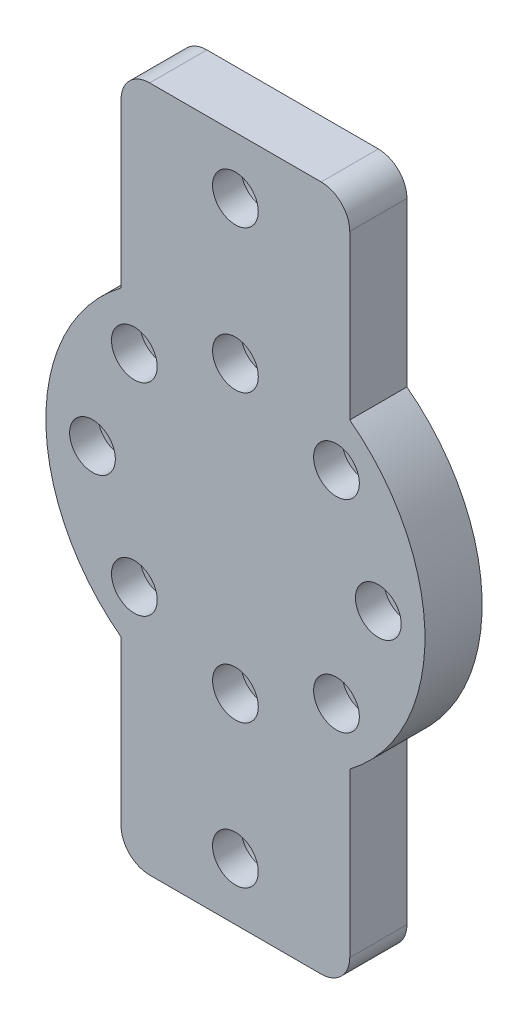
ISO-10303-21;
HEADER;
FILE_DESCRIPTION(('STEP AP214'),'2;1');
FILE_NAME('part.step','',(''),(''),'','','');
FILE_SCHEMA(('AUTOMOTIVE_DESIGN { 1 0 10303 214 1 1 1 1 }'));
ENDSEC;
DATA;
#1=APPLICATION_CONTEXT('core data for automotive mechanical design processes');
#2=APPLICATION_PROTOCOL_DEFINITION('international standard','automotive_design',2000,#1);
#3=PRODUCT_CONTEXT('',#1,'mechanical');
#4=PRODUCT('Part','Part','',(#3));
#5=PRODUCT_RELATED_PRODUCT_CATEGORY('part','',(#4));
#6=PRODUCT_DEFINITION_FORMATION('','',#4);
#7=PRODUCT_DEFINITION_CONTEXT('part definition',#1,'design');
#8=PRODUCT_DEFINITION('design','',#6,#7);
#9=PRODUCT_DEFINITION_SHAPE('','',#8);
#10=(LENGTH_UNIT() NAMED_UNIT(*) SI_UNIT(.MILLI.,.METRE.));
#11=(NAMED_UNIT(*) PLANE_ANGLE_UNIT() SI_UNIT($,.RADIAN.));
#12=(NAMED_UNIT(*) SI_UNIT($,.STERADIAN.) SOLID_ANGLE_UNIT());
#13=UNCERTAINTY_MEASURE_WITH_UNIT(LENGTH_MEASURE(1.E-05),#10,'distance_accuracy_value','');
#14=(GEOMETRIC_REPRESENTATION_CONTEXT(3) GLOBAL_UNCERTAINTY_ASSIGNED_CONTEXT((#13)) GLOBAL_UNIT_ASSIGNED_CONTEXT((#10,
#11,#12)) REPRESENTATION_CONTEXT('',''));
#15=CARTESIAN_POINT('',(0.,0.,0.));
#16=DIRECTION('',(0.,0.,1.));
#17=DIRECTION('',(1.,0.,0.));
#18=AXIS2_PLACEMENT_3D('',#15,#16,#17);
#19=CARTESIAN_POINT('',(0.,50.,10.));
#20=DIRECTION('',(0.,0.,-1.));
#21=DIRECTION('',(-1.,0.,0.));
#22=AXIS2_PLACEMENT_3D('',#19,#20,#21);
#23=CYLINDRICAL_SURFACE('',#22,4.00000000000001);
#24=CARTESIAN_POINT('',(0.,50.,10.));
#25=DIRECTION('',(0.,0.,1.));
#26=DIRECTION('',(1.,0.,0.));
#27=AXIS2_PLACEMENT_3D('',#24,#25,#26);
#28=CIRCLE('',#27,4.00000000000001);
#29=CARTESIAN_POINT('',(4.00000000000001,50.,10.));
#30=VERTEX_POINT('',#29);
#31=EDGE_CURVE('E297',#30,#30,#28,.T.);
#32=ORIENTED_EDGE('',*,*,#31,.T.);
#33=EDGE_LOOP('',(#32));
#34=FACE_BOUND('',#33,.T.);
#35=CARTESIAN_POINT('',(0.,50.,5.));
#36=DIRECTION('',(0.,0.,-1.));
#37=DIRECTION('',(-1.,0.,0.));
#38=AXIS2_PLACEMENT_3D('',#35,#36,#37);
#39=CIRCLE('',#38,4.00000000000001);
#40=CARTESIAN_POINT('',(-4.00000000000001,50.,5.));
#41=VERTEX_POINT('',#40);
#42=EDGE_CURVE('E36',#41,#41,#39,.T.);
#43=ORIENTED_EDGE('',*,*,#42,.T.);
#44=EDGE_LOOP('',(#43));
#45=FACE_BOUND('',#44,.T.);
#46=ADVANCED_FACE('F32',(#34,#45),#23,.F.);
#47=CARTESIAN_POINT('',(-24.9999999977,-2.29999999999998E-09,10.));
#48=DIRECTION('',(0.,0.,-1.));
#49=DIRECTION('',(-1.,0.,0.));
#50=AXIS2_PLACEMENT_3D('',#47,#48,#49);
#51=CYLINDRICAL_SURFACE('',#50,2.59999999999993);
#52=CARTESIAN_POINT('',(-24.9999999977,-2.29999999999998E-09,0.));
#53=DIRECTION('',(0.,0.,1.));
#54=DIRECTION('',(1.,0.,0.));
#55=AXIS2_PLACEMENT_3D('',#52,#53,#54);
#56=CIRCLE('',#55,2.59999999999993);
#57=CARTESIAN_POINT('',(-22.3999999977,-2.29999999999998E-09,0.));
#58=VERTEX_POINT('',#57);
#59=EDGE_CURVE('E160',#58,#58,#56,.T.);
#60=ORIENTED_EDGE('',*,*,#59,.F.);
#61=EDGE_LOOP('',(#60));
#62=FACE_BOUND('',#61,.T.);
#63=CARTESIAN_POINT('',(-24.9999999977,-2.29999999999998E-09,5.));
#64=DIRECTION('',(0.,0.,1.));
#65=DIRECTION('',(1.,0.,0.));
#66=AXIS2_PLACEMENT_3D('',#63,#64,#65);
#67=CIRCLE('',#66,2.59999999999993);
#68=CARTESIAN_POINT('',(-22.3999999977,-2.29999999999998E-09,5.));
#69=VERTEX_POINT('',#68);
#70=EDGE_CURVE('E225',#69,#69,#67,.T.);
#71=ORIENTED_EDGE('',*,*,#70,.T.);
#72=EDGE_LOOP('',(#71));
#73=FACE_BOUND('',#72,.T.);
#74=ADVANCED_FACE('F368',(#62,#73),#51,.F.);
#75=CARTESIAN_POINT('',(-17.6776695296637,17.6776695264109,10.));
#76=DIRECTION('',(0.,0.,-1.));
#77=DIRECTION('',(-1.,0.,0.));
#78=AXIS2_PLACEMENT_3D('',#75,#76,#77);
#79=CYLINDRICAL_SURFACE('',#78,2.59999999999984);
#80=CARTESIAN_POINT('',(-17.6776695296637,17.6776695264109,0.));
#81=DIRECTION('',(0.,0.,1.));
#82=DIRECTION('',(1.,0.,0.));
#83=AXIS2_PLACEMENT_3D('',#80,#81,#82);
#84=CIRCLE('',#83,2.59999999999984);
#85=CARTESIAN_POINT('',(-15.0776695296638,17.6776695264109,0.));
#86=VERTEX_POINT('',#85);
#87=EDGE_CURVE('E318',#86,#86,#84,.T.);
#88=ORIENTED_EDGE('',*,*,#87,.F.);
#89=EDGE_LOOP('',(#88));
#90=FACE_BOUND('',#89,.T.);
#91=CARTESIAN_POINT('',(-17.6776695296637,17.6776695264109,5.));
#92=DIRECTION('',(0.,0.,1.));
#93=DIRECTION('',(1.,0.,0.));
#94=AXIS2_PLACEMENT_3D('',#91,#92,#93);
#95=CIRCLE('',#94,2.59999999999984);
#96=CARTESIAN_POINT('',(-15.0776695296638,17.6776695264109,5.));
#97=VERTEX_POINT('',#96);
#98=EDGE_CURVE('E222',#97,#97,#95,.T.);
#99=ORIENTED_EDGE('',*,*,#98,.T.);
#100=EDGE_LOOP('',(#99));
#101=FACE_BOUND('',#100,.T.);
#102=ADVANCED_FACE('F374',(#90,#101),#79,.F.);
#103=CARTESIAN_POINT('',(-2.30000153080848E-09,24.9999999977,10.));
#104=DIRECTION('',(0.,0.,-1.));
#105=DIRECTION('',(-1.,0.,0.));
#106=AXIS2_PLACEMENT_3D('',#103,#104,#105);
#107=CYLINDRICAL_SURFACE('',#106,2.59999999999994);
#108=CARTESIAN_POINT('',(-2.30000153080848E-09,24.9999999977,0.));
#109=DIRECTION('',(0.,0.,1.));
#110=DIRECTION('',(1.,0.,0.));
#111=AXIS2_PLACEMENT_3D('',#108,#109,#110);
#112=CIRCLE('',#111,2.59999999999994);
#113=CARTESIAN_POINT('',(2.59999999769993,24.9999999977,0.));
#114=VERTEX_POINT('',#113);
#115=EDGE_CURVE('E315',#114,#114,#112,.T.);
#116=ORIENTED_EDGE('',*,*,#115,.F.);
#117=EDGE_LOOP('',(#116));
#118=FACE_BOUND('',#117,.T.);
#119=CARTESIAN_POINT('',(-2.30000153080848E-09,24.9999999977,5.));
#120=DIRECTION('',(0.,0.,1.));
#121=DIRECTION('',(1.,0.,0.));
#122=AXIS2_PLACEMENT_3D('',#119,#120,#121);
#123=CIRCLE('',#122,2.59999999999994);
#124=CARTESIAN_POINT('',(2.59999999769993,24.9999999977,5.));
#125=VERTEX_POINT('',#124);
#126=EDGE_CURVE('E219',#125,#125,#123,.T.);
#127=ORIENTED_EDGE('',*,*,#126,.T.);
#128=EDGE_LOOP('',(#127));
#129=FACE_BOUND('',#128,.T.);
#130=ADVANCED_FACE('F399',(#118,#129),#107,.F.);
#131=CARTESIAN_POINT('',(17.677669526411,17.6776695296637,10.));
#132=DIRECTION('',(0.,0.,-1.));
#133=DIRECTION('',(-1.,0.,0.));
#134=AXIS2_PLACEMENT_3D('',#131,#132,#133);
#135=CYLINDRICAL_SURFACE('',#134,2.59999999999984);
#136=CARTESIAN_POINT('',(17.677669526411,17.6776695296637,0.));
#137=DIRECTION('',(0.,0.,1.));
#138=DIRECTION('',(1.,0.,0.));
#139=AXIS2_PLACEMENT_3D('',#136,#137,#138);
#140=CIRCLE('',#139,2.59999999999984);
#141=CARTESIAN_POINT('',(20.2776695264109,17.6776695296637,0.));
#142=VERTEX_POINT('',#141);
#143=EDGE_CURVE('E312',#142,#142,#140,.T.);
#144=ORIENTED_EDGE('',*,*,#143,.F.);
#145=EDGE_LOOP('',(#144));
#146=FACE_BOUND('',#145,.T.);
#147=CARTESIAN_POINT('',(17.677669526411,17.6776695296637,5.));
#148=DIRECTION('',(0.,0.,1.));
#149=DIRECTION('',(1.,0.,0.));
#150=AXIS2_PLACEMENT_3D('',#147,#148,#149);
#151=CIRCLE('',#150,2.59999999999984);
#152=CARTESIAN_POINT('',(20.2776695264109,17.6776695296637,5.));
#153=VERTEX_POINT('',#152);
#154=EDGE_CURVE('E216',#153,#153,#151,.T.);
#155=ORIENTED_EDGE('',*,*,#154,.T.);
#156=EDGE_LOOP('',(#155));
#157=FACE_BOUND('',#156,.T.);
#158=ADVANCED_FACE('F395',(#146,#157),#135,.F.);
#159=CARTESIAN_POINT('',(24.9999999977,2.30000306161698E-09,10.));
#160=DIRECTION('',(0.,0.,-1.));
#161=DIRECTION('',(-1.,0.,0.));
#162=AXIS2_PLACEMENT_3D('',#159,#160,#161);
#163=CYLINDRICAL_SURFACE('',#162,2.59999999999993);
#164=CARTESIAN_POINT('',(24.9999999977,2.30000306161698E-09,0.));
#165=DIRECTION('',(0.,0.,1.));
#166=DIRECTION('',(1.,0.,0.));
#167=AXIS2_PLACEMENT_3D('',#164,#165,#166);
#168=CIRCLE('',#167,2.59999999999993);
#169=CARTESIAN_POINT('',(27.5999999976999,2.30000306161698E-09,0.));
#170=VERTEX_POINT('',#169);
#171=EDGE_CURVE('E309',#170,#170,#168,.T.);
#172=ORIENTED_EDGE('',*,*,#171,.F.);
#173=EDGE_LOOP('',(#172));
#174=FACE_BOUND('',#173,.T.);
#175=CARTESIAN_POINT('',(24.9999999977,2.30000306161698E-09,5.));
#176=DIRECTION('',(0.,0.,1.));
#177=DIRECTION('',(1.,0.,0.));
#178=AXIS2_PLACEMENT_3D('',#175,#176,#177);
#179=CIRCLE('',#178,2.59999999999993);
#180=CARTESIAN_POINT('',(27.5999999976999,2.30000306161698E-09,5.));
#181=VERTEX_POINT('',#180);
#182=EDGE_CURVE('E213',#181,#181,#179,.T.);
#183=ORIENTED_EDGE('',*,*,#182,.T.);
#184=EDGE_LOOP('',(#183));
#185=FACE_BOUND('',#184,.T.);
#186=ADVANCED_FACE('F391',(#174,#185),#163,.F.);
#187=CARTESIAN_POINT('',(17.6776695296637,-17.677669526411,10.));
#188=DIRECTION('',(0.,0.,-1.));
#189=DIRECTION('',(-1.,0.,0.));
#190=AXIS2_PLACEMENT_3D('',#187,#188,#189);
#191=CYLINDRICAL_SURFACE('',#190,2.6);
#192=CARTESIAN_POINT('',(17.6776695296637,-17.677669526411,0.));
#193=DIRECTION('',(0.,0.,1.));
#194=DIRECTION('',(1.,0.,0.));
#195=AXIS2_PLACEMENT_3D('',#192,#193,#194);
#196=CIRCLE('',#195,2.6);
#197=CARTESIAN_POINT('',(20.2776695296637,-17.677669526411,0.));
#198=VERTEX_POINT('',#197);
#199=EDGE_CURVE('E306',#198,#198,#196,.T.);
#200=ORIENTED_EDGE('',*,*,#199,.F.);
#201=EDGE_LOOP('',(#200));
#202=FACE_BOUND('',#201,.T.);
#203=CARTESIAN_POINT('',(17.6776695296637,-17.677669526411,5.));
#204=DIRECTION('',(0.,0.,1.));
#205=DIRECTION('',(1.,0.,0.));
#206=AXIS2_PLACEMENT_3D('',#203,#204,#205);
#207=CIRCLE('',#206,2.6);
#208=CARTESIAN_POINT('',(20.2776695296637,-17.677669526411,5.));
#209=VERTEX_POINT('',#208);
#210=EDGE_CURVE('E210',#209,#209,#207,.T.);
#211=ORIENTED_EDGE('',*,*,#210,.T.);
#212=EDGE_LOOP('',(#211));
#213=FACE_BOUND('',#212,.T.);
#214=ADVANCED_FACE('F387',(#202,#213),#191,.F.);
#215=CARTESIAN_POINT('',(2.30000459242548E-09,-24.9999999977,10.));
#216=DIRECTION('',(0.,0.,-1.));
#217=DIRECTION('',(-1.,0.,0.));
#218=AXIS2_PLACEMENT_3D('',#215,#216,#217);
#219=CYLINDRICAL_SURFACE('',#218,2.59999999999994);
#220=CARTESIAN_POINT('',(2.30000459242548E-09,-24.9999999977,0.));
#221=DIRECTION('',(0.,0.,1.));
#222=DIRECTION('',(1.,0.,0.));
#223=AXIS2_PLACEMENT_3D('',#220,#221,#222);
#224=CIRCLE('',#223,2.59999999999994);
#225=CARTESIAN_POINT('',(2.60000000229994,-24.9999999977,0.));
#226=VERTEX_POINT('',#225);
#227=EDGE_CURVE('E303',#226,#226,#224,.T.);
#228=ORIENTED_EDGE('',*,*,#227,.F.);
#229=EDGE_LOOP('',(#228));
#230=FACE_BOUND('',#229,.T.);
#231=CARTESIAN_POINT('',(2.30000459242548E-09,-24.9999999977,5.));
#232=DIRECTION('',(0.,0.,1.));
#233=DIRECTION('',(1.,0.,0.));
#234=AXIS2_PLACEMENT_3D('',#231,#232,#233);
#235=CIRCLE('',#234,2.59999999999994);
#236=CARTESIAN_POINT('',(2.60000000229994,-24.9999999977,5.));
#237=VERTEX_POINT('',#236);
#238=EDGE_CURVE('E206',#237,#237,#235,.T.);
#239=ORIENTED_EDGE('',*,*,#238,.T.);
#240=EDGE_LOOP('',(#239));
#241=FACE_BOUND('',#240,.T.);
#242=ADVANCED_FACE('F383',(#230,#241),#219,.F.);
#243=CARTESIAN_POINT('',(-17.6776695264109,-17.6776695296637,10.));
#244=DIRECTION('',(0.,0.,-1.));
#245=DIRECTION('',(-1.,0.,0.));
#246=AXIS2_PLACEMENT_3D('',#243,#244,#245);
#247=CYLINDRICAL_SURFACE('',#246,2.59999999999992);
#248=CARTESIAN_POINT('',(-17.6776695264109,-17.6776695296637,0.));
#249=DIRECTION('',(0.,0.,1.));
#250=DIRECTION('',(1.,0.,0.));
#251=AXIS2_PLACEMENT_3D('',#248,#249,#250);
#252=CIRCLE('',#251,2.59999999999992);
#253=CARTESIAN_POINT('',(-15.077669526411,-17.6776695296637,0.));
#254=VERTEX_POINT('',#253);
#255=EDGE_CURVE('E300',#254,#254,#252,.T.);
#256=ORIENTED_EDGE('',*,*,#255,.F.);
#257=EDGE_LOOP('',(#256));
#258=FACE_BOUND('',#257,.T.);
#259=CARTESIAN_POINT('',(-17.6776695264109,-17.6776695296637,5.));
#260=DIRECTION('',(0.,0.,1.));
#261=DIRECTION('',(1.,0.,0.));
#262=AXIS2_PLACEMENT_3D('',#259,#260,#261);
#263=CIRCLE('',#262,2.59999999999992);
#264=CARTESIAN_POINT('',(-15.077669526411,-17.6776695296637,5.));
#265=VERTEX_POINT('',#264);
#266=EDGE_CURVE('E203',#265,#265,#263,.T.);
#267=ORIENTED_EDGE('',*,*,#266,.T.);
#268=EDGE_LOOP('',(#267));
#269=FACE_BOUND('',#268,.T.);
#270=ADVANCED_FACE('F380',(#258,#269),#247,.F.);
#271=CARTESIAN_POINT('',(0.,0.,10.));
#272=DIRECTION('',(0.,0.,1.));
#273=DIRECTION('',(1.,0.,0.));
#274=AXIS2_PLACEMENT_3D('',#271,#272,#273);
#275=PLANE('',#274);
#276=CARTESIAN_POINT('',(17.6776695264105,17.6776695296635,10.));
#277=DIRECTION('',(0.,0.,1.));
#278=DIRECTION('',(1.,0.,0.));
#279=AXIS2_PLACEMENT_3D('',#276,#277,#278);
#280=CIRCLE('',#279,4.00000000000032);
#281=CARTESIAN_POINT('',(21.6776695264108,17.6776695296635,10.));
#282=VERTEX_POINT('',#281);
#283=EDGE_CURVE('E234',#282,#282,#280,.T.);
#284=ORIENTED_EDGE('',*,*,#283,.F.);
#285=EDGE_LOOP('',(#284));
#286=FACE_BOUND('',#285,.T.);
#287=CARTESIAN_POINT('',(-2.3007056022973E-09,24.9999999976993,10.));
#288=DIRECTION('',(0.,0.,1.));
#289=DIRECTION('',(1.,0.,0.));
#290=AXIS2_PLACEMENT_3D('',#287,#288,#289);
#291=CIRCLE('',#290,4.00000000000038);
#292=CARTESIAN_POINT('',(3.99999999769968,24.9999999976993,10.));
#293=VERTEX_POINT('',#292);
#294=EDGE_CURVE('E283',#293,#293,#291,.T.);
#295=ORIENTED_EDGE('',*,*,#294,.F.);
#296=EDGE_LOOP('',(#295));
#297=FACE_BOUND('',#296,.T.);
#298=CARTESIAN_POINT('',(-17.6776695296642,17.6776695264098,10.));
#299=DIRECTION('',(0.,0.,1.));
#300=DIRECTION('',(1.,0.,0.));
#301=AXIS2_PLACEMENT_3D('',#298,#299,#300);
#302=CIRCLE('',#301,4.00000000000006);
#303=CARTESIAN_POINT('',(-13.6776695296641,17.6776695264098,10.));
#304=VERTEX_POINT('',#303);
#305=EDGE_CURVE('E277',#304,#304,#302,.T.);
#306=ORIENTED_EDGE('',*,*,#305,.F.);
#307=EDGE_LOOP('',(#306));
#308=FACE_BOUND('',#307,.T.);
#309=CARTESIAN_POINT('',(-24.9999999977,-2.30140201974362E-09,10.));
#310=DIRECTION('',(0.,0.,1.));
#311=DIRECTION('',(1.,0.,0.));
#312=AXIS2_PLACEMENT_3D('',#309,#310,#311);
#313=CIRCLE('',#312,3.99999999999954);
#314=CARTESIAN_POINT('',(-20.9999999977004,-2.30140201974362E-09,10.));
#315=VERTEX_POINT('',#314);
#316=EDGE_CURVE('E271',#315,#315,#313,.T.);
#317=ORIENTED_EDGE('',*,*,#316,.F.);
#318=EDGE_LOOP('',(#317));
#319=FACE_BOUND('',#318,.T.);
#320=CARTESIAN_POINT('',(-17.6776695264105,-17.6776695296649,10.));
#321=DIRECTION('',(0.,0.,1.));
#322=DIRECTION('',(1.,0.,0.));
#323=AXIS2_PLACEMENT_3D('',#320,#321,#322);
#324=CIRCLE('',#323,3.99999999999914);
#325=CARTESIAN_POINT('',(-13.6776695264113,-17.6776695296649,10.));
#326=VERTEX_POINT('',#325);
#327=EDGE_CURVE('E265',#326,#326,#324,.T.);
#328=ORIENTED_EDGE('',*,*,#327,.F.);
#329=EDGE_LOOP('',(#328));
#330=FACE_BOUND('',#329,.T.);
#331=CARTESIAN_POINT('',(2.3007025406803E-09,-24.9999999977007,10.));
#332=DIRECTION('',(0.,0.,1.));
#333=DIRECTION('',(1.,0.,0.));
#334=AXIS2_PLACEMENT_3D('',#331,#332,#333);
#335=CIRCLE('',#334,3.99999999999911);
#336=CARTESIAN_POINT('',(4.00000000229981,-24.9999999977007,10.));
#337=VERTEX_POINT('',#336);
#338=EDGE_CURVE('E259',#337,#337,#335,.T.);
#339=ORIENTED_EDGE('',*,*,#338,.F.);
#340=EDGE_LOOP('',(#339));
#341=FACE_BOUND('',#340,.T.);
#342=CARTESIAN_POINT('',(17.6776695296636,-17.677669526411,10.));
#343=DIRECTION('',(0.,0.,1.));
#344=DIRECTION('',(1.,0.,0.));
#345=AXIS2_PLACEMENT_3D('',#342,#343,#344);
#346=CIRCLE('',#345,4.);
#347=CARTESIAN_POINT('',(21.6776695296636,-17.677669526411,10.));
#348=VERTEX_POINT('',#347);
#349=EDGE_CURVE('E253',#348,#348,#346,.T.);
#350=ORIENTED_EDGE('',*,*,#349,.F.);
#351=EDGE_LOOP('',(#350));
#352=FACE_BOUND('',#351,.T.);
#353=CARTESIAN_POINT('',(24.9999999977,2.30000306161698E-09,10.));
#354=DIRECTION('',(0.,0.,1.));
#355=DIRECTION('',(1.,0.,0.));
#356=AXIS2_PLACEMENT_3D('',#353,#354,#355);
#357=CIRCLE('',#356,4.);
#358=CARTESIAN_POINT('',(28.9999999977,2.30000306161698E-09,10.));
#359=VERTEX_POINT('',#358);
#360=EDGE_CURVE('E252',#359,#359,#357,.T.);
#361=ORIENTED_EDGE('',*,*,#360,.F.);
#362=EDGE_LOOP('',(#361));
#363=FACE_BOUND('',#362,.T.);
#364=ORIENTED_EDGE('',*,*,#31,.F.);
#365=EDGE_LOOP('',(#364));
#366=FACE_BOUND('',#365,.T.);
#367=CARTESIAN_POINT('',(0.,0.,10.));
#368=DIRECTION('',(0.,0.,1.));
#369=DIRECTION('',(1.,0.,0.));
#370=AXIS2_PLACEMENT_3D('',#367,#368,#369);
#371=CIRCLE('',#370,33.1543338630527);
#372=CARTESIAN_POINT('',(20.,-26.4425765367666,10.));
#373=VERTEX_POINT('',#372);
#374=CARTESIAN_POINT('',(20.,26.4425765367666,10.));
#375=VERTEX_POINT('',#374);
#376=EDGE_CURVE('E179',#373,#375,#371,.T.);
#377=ORIENTED_EDGE('',*,*,#376,.T.);
#378=DIRECTION('',(0.,1.,0.));
#379=VECTOR('',#378,1.);
#380=CARTESIAN_POINT('',(20.,55.,10.));
#381=LINE('',#380,#379);
#382=CARTESIAN_POINT('',(20.,55.,10.));
#383=VERTEX_POINT('',#382);
#384=EDGE_CURVE('E106',#375,#383,#381,.T.);
#385=ORIENTED_EDGE('',*,*,#384,.T.);
#386=CARTESIAN_POINT('',(15.,55.,10.));
#387=DIRECTION('',(0.,0.,1.));
#388=DIRECTION('',(-1.,0.,0.));
#389=AXIS2_PLACEMENT_3D('',#386,#387,#388);
#390=CIRCLE('',#389,5.);
#391=CARTESIAN_POINT('',(15.,60.,10.));
#392=VERTEX_POINT('',#391);
#393=EDGE_CURVE('E325',#383,#392,#390,.T.);
#394=ORIENTED_EDGE('',*,*,#393,.T.);
#395=DIRECTION('',(-1.,0.,0.));
#396=VECTOR('',#395,1.);
#397=CARTESIAN_POINT('',(-15.,60.,10.));
#398=LINE('',#397,#396);
#399=CARTESIAN_POINT('',(-15.,60.,10.));
#400=VERTEX_POINT('',#399);
#401=EDGE_CURVE('E327',#392,#400,#398,.T.);
#402=ORIENTED_EDGE('',*,*,#401,.T.);
#403=CARTESIAN_POINT('',(-15.,55.,10.));
#404=DIRECTION('',(0.,0.,1.));
#405=DIRECTION('',(1.,0.,0.));
#406=AXIS2_PLACEMENT_3D('',#403,#404,#405);
#407=CIRCLE('',#406,5.);
#408=CARTESIAN_POINT('',(-20.,55.,10.));
#409=VERTEX_POINT('',#408);
#410=EDGE_CURVE('E329',#400,#409,#407,.T.);
#411=ORIENTED_EDGE('',*,*,#410,.T.);
#412=DIRECTION('',(0.,-1.,0.));
#413=VECTOR('',#412,1.);
#414=CARTESIAN_POINT('',(-20.,55.,10.));
#415=LINE('',#414,#413);
#416=CARTESIAN_POINT('',(-20.,26.4425765367666,10.));
#417=VERTEX_POINT('',#416);
#418=EDGE_CURVE('E331',#409,#417,#415,.T.);
#419=ORIENTED_EDGE('',*,*,#418,.T.);
#420=CARTESIAN_POINT('',(0.,0.,10.));
#421=DIRECTION('',(0.,0.,1.));
#422=DIRECTION('',(1.,0.,0.));
#423=AXIS2_PLACEMENT_3D('',#420,#421,#422);
#424=CIRCLE('',#423,33.1543338630527);
#425=CARTESIAN_POINT('',(-20.,-26.4425765367666,10.));
#426=VERTEX_POINT('',#425);
#427=EDGE_CURVE('E333',#417,#426,#424,.T.);
#428=ORIENTED_EDGE('',*,*,#427,.T.);
#429=DIRECTION('',(0.,-1.,0.));
#430=VECTOR('',#429,1.);
#431=CARTESIAN_POINT('',(-20.,-26.4425765367666,10.));
#432=LINE('',#431,#430);
#433=CARTESIAN_POINT('',(-20.,-54.6654795180769,10.));
#434=VERTEX_POINT('',#433);
#435=EDGE_CURVE('E335',#426,#434,#432,.T.);
#436=ORIENTED_EDGE('',*,*,#435,.T.);
#437=CARTESIAN_POINT('',(-15.0112029458822,-55.,10.));
#438=DIRECTION('',(0.,0.,1.));
#439=DIRECTION('',(-1.,0.,0.));
#440=AXIS2_PLACEMENT_3D('',#437,#438,#439);
#441=CIRCLE('',#440,5.);
#442=CARTESIAN_POINT('',(-15.0112029458822,-60.,10.));
#443=VERTEX_POINT('',#442);
#444=EDGE_CURVE('E138',#434,#443,#441,.T.);
#445=ORIENTED_EDGE('',*,*,#444,.T.);
#446=DIRECTION('',(1.,0.,0.));
#447=VECTOR('',#446,1.);
#448=CARTESIAN_POINT('',(-15.0112029458822,-60.,10.));
#449=LINE('',#448,#447);
#450=CARTESIAN_POINT('',(15.,-60.,10.));
#451=VERTEX_POINT('',#450);
#452=EDGE_CURVE('E131',#443,#451,#449,.T.);
#453=ORIENTED_EDGE('',*,*,#452,.T.);
#454=CARTESIAN_POINT('',(15.,-55.,10.));
#455=DIRECTION('',(0.,0.,1.));
#456=DIRECTION('',(1.,0.,0.));
#457=AXIS2_PLACEMENT_3D('',#454,#455,#456);
#458=CIRCLE('',#457,5.);
#459=CARTESIAN_POINT('',(20.,-55.,10.));
#460=VERTEX_POINT('',#459);
#461=EDGE_CURVE('E136',#451,#460,#458,.T.);
#462=ORIENTED_EDGE('',*,*,#461,.T.);
#463=DIRECTION('',(0.,1.,0.));
#464=VECTOR('',#463,1.);
#465=CARTESIAN_POINT('',(20.,-26.4425765367666,10.));
#466=LINE('',#465,#464);
#467=EDGE_CURVE('E51',#460,#373,#466,.T.);
#468=ORIENTED_EDGE('',*,*,#467,.T.);
#469=EDGE_LOOP('',(#377,#385,#394,#402,#411,#419,#428,#436,#445,#453,#462,#468));
#470=FACE_BOUND('',#469,.T.);
#471=CARTESIAN_POINT('',(0.,-50.,10.));
#472=DIRECTION('',(0.,0.,1.));
#473=DIRECTION('',(-1.,0.,0.));
#474=AXIS2_PLACEMENT_3D('',#471,#472,#473);
#475=CIRCLE('',#474,4.00000000000001);
#476=CARTESIAN_POINT('',(-4.00000000000001,-50.,10.));
#477=VERTEX_POINT('',#476);
#478=EDGE_CURVE('E227',#477,#477,#475,.T.);
#479=ORIENTED_EDGE('',*,*,#478,.F.);
#480=EDGE_LOOP('',(#479));
#481=FACE_BOUND('',#480,.T.);
#482=ADVANCED_FACE('F133',(#286,#297,#308,#319,#330,#341,#352,#363,#366,#470,#481),#275,.T.);
#483=CARTESIAN_POINT('',(0.,0.,0.));
#484=DIRECTION('',(0.,0.,1.));
#485=DIRECTION('',(1.,0.,0.));
#486=AXIS2_PLACEMENT_3D('',#483,#484,#485);
#487=PLANE('',#486);
#488=CARTESIAN_POINT('',(0.,50.,0.));
#489=DIRECTION('',(0.,0.,-1.));
#490=DIRECTION('',(-1.,0.,0.));
#491=AXIS2_PLACEMENT_3D('',#488,#489,#490);
#492=CIRCLE('',#491,7.);
#493=CARTESIAN_POINT('',(-7.,50.,0.));
#494=VERTEX_POINT('',#493);
#495=EDGE_CURVE('E236',#494,#494,#492,.T.);
#496=ORIENTED_EDGE('',*,*,#495,.F.);
#497=EDGE_LOOP('',(#496));
#498=FACE_BOUND('',#497,.T.);
#499=CARTESIAN_POINT('',(0.,-50.,0.));
#500=DIRECTION('',(0.,0.,-1.));
#501=DIRECTION('',(1.,0.,0.));
#502=AXIS2_PLACEMENT_3D('',#499,#500,#501);
#503=CIRCLE('',#502,7.);
#504=CARTESIAN_POINT('',(7.,-50.,0.));
#505=VERTEX_POINT('',#504);
#506=EDGE_CURVE('E246',#505,#505,#503,.T.);
#507=ORIENTED_EDGE('',*,*,#506,.F.);
#508=EDGE_LOOP('',(#507));
#509=FACE_BOUND('',#508,.T.);
#510=CARTESIAN_POINT('',(0.,0.,0.));
#511=DIRECTION('',(0.,0.,1.));
#512=DIRECTION('',(1.,0.,0.));
#513=AXIS2_PLACEMENT_3D('',#510,#511,#512);
#514=CIRCLE('',#513,33.1543338630527);
#515=CARTESIAN_POINT('',(20.,-26.4425765367666,0.));
#516=VERTEX_POINT('',#515);
#517=CARTESIAN_POINT('',(20.,26.4425765367666,0.));
#518=VERTEX_POINT('',#517);
#519=EDGE_CURVE('E156',#516,#518,#514,.T.);
#520=ORIENTED_EDGE('',*,*,#519,.F.);
#521=DIRECTION('',(0.,1.,0.));
#522=VECTOR('',#521,1.);
#523=CARTESIAN_POINT('',(20.,-26.4425765367666,0.));
#524=LINE('',#523,#522);
#525=CARTESIAN_POINT('',(20.,-55.,0.));
#526=VERTEX_POINT('',#525);
#527=EDGE_CURVE('E98',#526,#516,#524,.T.);
#528=ORIENTED_EDGE('',*,*,#527,.F.);
#529=CARTESIAN_POINT('',(15.,-55.,0.));
#530=DIRECTION('',(0.,0.,1.));
#531=DIRECTION('',(1.,0.,0.));
#532=AXIS2_PLACEMENT_3D('',#529,#530,#531);
#533=CIRCLE('',#532,5.);
#534=CARTESIAN_POINT('',(15.,-60.,0.));
#535=VERTEX_POINT('',#534);
#536=EDGE_CURVE('E92',#535,#526,#533,.T.);
#537=ORIENTED_EDGE('',*,*,#536,.F.);
#538=DIRECTION('',(1.,0.,0.));
#539=VECTOR('',#538,1.);
#540=CARTESIAN_POINT('',(-15.0112029458822,-60.,0.));
#541=LINE('',#540,#539);
#542=CARTESIAN_POINT('',(-15.0112029458822,-60.,0.));
#543=VERTEX_POINT('',#542);
#544=EDGE_CURVE('E146',#543,#535,#541,.T.);
#545=ORIENTED_EDGE('',*,*,#544,.F.);
#546=CARTESIAN_POINT('',(-15.0112029458822,-55.,0.));
#547=DIRECTION('',(0.,0.,1.));
#548=DIRECTION('',(-1.,0.,0.));
#549=AXIS2_PLACEMENT_3D('',#546,#547,#548);
#550=CIRCLE('',#549,5.);
#551=CARTESIAN_POINT('',(-20.,-54.6654795180769,0.));
#552=VERTEX_POINT('',#551);
#553=EDGE_CURVE('E174',#552,#543,#550,.T.);
#554=ORIENTED_EDGE('',*,*,#553,.F.);
#555=DIRECTION('',(0.,-1.,0.));
#556=VECTOR('',#555,1.);
#557=CARTESIAN_POINT('',(-20.,-26.4425765367666,0.));
#558=LINE('',#557,#556);
#559=CARTESIAN_POINT('',(-20.,-26.4425765367666,0.));
#560=VERTEX_POINT('',#559);
#561=EDGE_CURVE('E172',#560,#552,#558,.T.);
#562=ORIENTED_EDGE('',*,*,#561,.F.);
#563=CARTESIAN_POINT('',(0.,0.,0.));
#564=DIRECTION('',(0.,0.,1.));
#565=DIRECTION('',(1.,0.,0.));
#566=AXIS2_PLACEMENT_3D('',#563,#564,#565);
#567=CIRCLE('',#566,33.1543338630527);
#568=CARTESIAN_POINT('',(-20.,26.4425765367666,0.));
#569=VERTEX_POINT('',#568);
#570=EDGE_CURVE('E170',#569,#560,#567,.T.);
#571=ORIENTED_EDGE('',*,*,#570,.F.);
#572=DIRECTION('',(0.,-1.,0.));
#573=VECTOR('',#572,1.);
#574=CARTESIAN_POINT('',(-20.,55.,0.));
#575=LINE('',#574,#573);
#576=CARTESIAN_POINT('',(-20.,55.,0.));
#577=VERTEX_POINT('',#576);
#578=EDGE_CURVE('E168',#577,#569,#575,.T.);
#579=ORIENTED_EDGE('',*,*,#578,.F.);
#580=CARTESIAN_POINT('',(-15.,55.,0.));
#581=DIRECTION('',(0.,0.,1.));
#582=DIRECTION('',(1.,0.,0.));
#583=AXIS2_PLACEMENT_3D('',#580,#581,#582);
#584=CIRCLE('',#583,5.);
#585=CARTESIAN_POINT('',(-15.,60.,0.));
#586=VERTEX_POINT('',#585);
#587=EDGE_CURVE('E166',#586,#577,#584,.T.);
#588=ORIENTED_EDGE('',*,*,#587,.F.);
#589=DIRECTION('',(-1.,0.,0.));
#590=VECTOR('',#589,1.);
#591=CARTESIAN_POINT('',(-15.,60.,0.));
#592=LINE('',#591,#590);
#593=CARTESIAN_POINT('',(15.,60.,0.));
#594=VERTEX_POINT('',#593);
#595=EDGE_CURVE('E164',#594,#586,#592,.T.);
#596=ORIENTED_EDGE('',*,*,#595,.F.);
#597=CARTESIAN_POINT('',(15.,55.,0.));
#598=DIRECTION('',(0.,0.,1.));
#599=DIRECTION('',(-1.,0.,0.));
#600=AXIS2_PLACEMENT_3D('',#597,#598,#599);
#601=CIRCLE('',#600,5.);
#602=CARTESIAN_POINT('',(20.,55.,0.));
#603=VERTEX_POINT('',#602);
#604=EDGE_CURVE('E162',#603,#594,#601,.T.);
#605=ORIENTED_EDGE('',*,*,#604,.F.);
#606=DIRECTION('',(0.,1.,0.));
#607=VECTOR('',#606,1.);
#608=CARTESIAN_POINT('',(20.,55.,0.));
#609=LINE('',#608,#607);
#610=EDGE_CURVE('E159',#518,#603,#609,.T.);
#611=ORIENTED_EDGE('',*,*,#610,.F.);
#612=EDGE_LOOP('',(#520,#528,#537,#545,#554,#562,#571,#579,#588,#596,#605,#611));
#613=FACE_BOUND('',#612,.T.);
#614=ORIENTED_EDGE('',*,*,#59,.T.);
#615=EDGE_LOOP('',(#614));
#616=FACE_BOUND('',#615,.T.);
#617=ORIENTED_EDGE('',*,*,#87,.T.);
#618=EDGE_LOOP('',(#617));
#619=FACE_BOUND('',#618,.T.);
#620=ORIENTED_EDGE('',*,*,#115,.T.);
#621=EDGE_LOOP('',(#620));
#622=FACE_BOUND('',#621,.T.);
#623=ORIENTED_EDGE('',*,*,#143,.T.);
#624=EDGE_LOOP('',(#623));
#625=FACE_BOUND('',#624,.T.);
#626=ORIENTED_EDGE('',*,*,#171,.T.);
#627=EDGE_LOOP('',(#626));
#628=FACE_BOUND('',#627,.T.);
#629=ORIENTED_EDGE('',*,*,#199,.T.);
#630=EDGE_LOOP('',(#629));
#631=FACE_BOUND('',#630,.T.);
#632=ORIENTED_EDGE('',*,*,#227,.T.);
#633=EDGE_LOOP('',(#632));
#634=FACE_BOUND('',#633,.T.);
#635=ORIENTED_EDGE('',*,*,#255,.T.);
#636=EDGE_LOOP('',(#635));
#637=FACE_BOUND('',#636,.T.);
#638=ADVANCED_FACE('F348',(#498,#509,#613,#616,#619,#622,#625,#628,#631,#634,#637),#487,.F.);
#639=CARTESIAN_POINT('',(0.,0.,10.));
#640=DIRECTION('',(0.,0.,-1.));
#641=DIRECTION('',(-1.,0.,0.));
#642=AXIS2_PLACEMENT_3D('',#639,#640,#641);
#643=CYLINDRICAL_SURFACE('',#642,33.1543338630527);
#644=ORIENTED_EDGE('',*,*,#519,.T.);
#645=DIRECTION('',(0.,0.,-1.));
#646=VECTOR('',#645,1.);
#647=CARTESIAN_POINT('',(20.,26.4425765367666,10.));
#648=LINE('',#647,#646);
#649=EDGE_CURVE('E11',#375,#518,#648,.T.);
#650=ORIENTED_EDGE('',*,*,#649,.F.);
#651=ORIENTED_EDGE('',*,*,#376,.F.);
#652=DIRECTION('',(0.,0.,-1.));
#653=VECTOR('',#652,1.);
#654=CARTESIAN_POINT('',(20.,-26.4425765367666,10.));
#655=LINE('',#654,#653);
#656=EDGE_CURVE('E152',#373,#516,#655,.T.);
#657=ORIENTED_EDGE('',*,*,#656,.T.);
#658=EDGE_LOOP('',(#644,#650,#651,#657));
#659=FACE_BOUND('',#658,.T.);
#660=ADVANCED_FACE('F34',(#659),#643,.T.);
#661=CARTESIAN_POINT('',(20.,55.,10.));
#662=DIRECTION('',(-1.,0.,0.));
#663=DIRECTION('',(0.,-1.,0.));
#664=AXIS2_PLACEMENT_3D('',#661,#662,#663);
#665=PLANE('',#664);
#666=ORIENTED_EDGE('',*,*,#610,.T.);
#667=DIRECTION('',(0.,0.,-1.));
#668=VECTOR('',#667,1.);
#669=CARTESIAN_POINT('',(20.,55.,10.));
#670=LINE('',#669,#668);
#671=EDGE_CURVE('E42',#383,#603,#670,.T.);
#672=ORIENTED_EDGE('',*,*,#671,.F.);
#673=ORIENTED_EDGE('',*,*,#384,.F.);
#674=ORIENTED_EDGE('',*,*,#649,.T.);
#675=EDGE_LOOP('',(#666,#672,#673,#674));
#676=FACE_BOUND('',#675,.T.);
#677=ADVANCED_FACE('F414',(#676),#665,.F.);
#678=CARTESIAN_POINT('',(15.,55.,10.));
#679=DIRECTION('',(0.,0.,-1.));
#680=DIRECTION('',(-1.,0.,0.));
#681=AXIS2_PLACEMENT_3D('',#678,#679,#680);
#682=CYLINDRICAL_SURFACE('',#681,5.);
#683=ORIENTED_EDGE('',*,*,#604,.T.);
#684=DIRECTION('',(0.,0.,-1.));
#685=VECTOR('',#684,1.);
#686=CARTESIAN_POINT('',(15.,60.,10.));
#687=LINE('',#686,#685);
#688=EDGE_CURVE('E198',#392,#594,#687,.T.);
#689=ORIENTED_EDGE('',*,*,#688,.F.);
#690=ORIENTED_EDGE('',*,*,#393,.F.);
#691=ORIENTED_EDGE('',*,*,#671,.T.);
#692=EDGE_LOOP('',(#683,#689,#690,#691));
#693=FACE_BOUND('',#692,.T.);
#694=ADVANCED_FACE('F765',(#693),#682,.T.);
#695=CARTESIAN_POINT('',(-15.,60.,10.));
#696=DIRECTION('',(0.,-1.,0.));
#697=DIRECTION('',(0.,0.,-1.));
#698=AXIS2_PLACEMENT_3D('',#695,#696,#697);
#699=PLANE('',#698);
#700=ORIENTED_EDGE('',*,*,#595,.T.);
#701=DIRECTION('',(0.,0.,-1.));
#702=VECTOR('',#701,1.);
#703=CARTESIAN_POINT('',(-15.,60.,10.));
#704=LINE('',#703,#702);
#705=EDGE_CURVE('E195',#400,#586,#704,.T.);
#706=ORIENTED_EDGE('',*,*,#705,.F.);
#707=ORIENTED_EDGE('',*,*,#401,.F.);
#708=ORIENTED_EDGE('',*,*,#688,.T.);
#709=EDGE_LOOP('',(#700,#706,#707,#708));
#710=FACE_BOUND('',#709,.T.);
#711=ADVANCED_FACE('F755',(#710),#699,.F.);
#712=CARTESIAN_POINT('',(-15.,55.,10.));
#713=DIRECTION('',(0.,0.,-1.));
#714=DIRECTION('',(-1.,0.,0.));
#715=AXIS2_PLACEMENT_3D('',#712,#713,#714);
#716=CYLINDRICAL_SURFACE('',#715,5.);
#717=ORIENTED_EDGE('',*,*,#587,.T.);
#718=DIRECTION('',(0.,0.,-1.));
#719=VECTOR('',#718,1.);
#720=CARTESIAN_POINT('',(-20.,55.,10.));
#721=LINE('',#720,#719);
#722=EDGE_CURVE('E192',#409,#577,#721,.T.);
#723=ORIENTED_EDGE('',*,*,#722,.F.);
#724=ORIENTED_EDGE('',*,*,#410,.F.);
#725=ORIENTED_EDGE('',*,*,#705,.T.);
#726=EDGE_LOOP('',(#717,#723,#724,#725));
#727=FACE_BOUND('',#726,.T.);
#728=ADVANCED_FACE('F745',(#727),#716,.T.);
#729=CARTESIAN_POINT('',(-20.,55.,10.));
#730=DIRECTION('',(1.,0.,0.));
#731=DIRECTION('',(0.,0.,-1.));
#732=AXIS2_PLACEMENT_3D('',#729,#730,#731);
#733=PLANE('',#732);
#734=ORIENTED_EDGE('',*,*,#578,.T.);
#735=DIRECTION('',(0.,0.,-1.));
#736=VECTOR('',#735,1.);
#737=CARTESIAN_POINT('',(-20.,26.4425765367666,10.));
#738=LINE('',#737,#736);
#739=EDGE_CURVE('E189',#417,#569,#738,.T.);
#740=ORIENTED_EDGE('',*,*,#739,.F.);
#741=ORIENTED_EDGE('',*,*,#418,.F.);
#742=ORIENTED_EDGE('',*,*,#722,.T.);
#743=EDGE_LOOP('',(#734,#740,#741,#742));
#744=FACE_BOUND('',#743,.T.);
#745=ADVANCED_FACE('F735',(#744),#733,.F.);
#746=CARTESIAN_POINT('',(0.,0.,10.));
#747=DIRECTION('',(0.,0.,-1.));
#748=DIRECTION('',(-1.,0.,0.));
#749=AXIS2_PLACEMENT_3D('',#746,#747,#748);
#750=CYLINDRICAL_SURFACE('',#749,33.1543338630527);
#751=ORIENTED_EDGE('',*,*,#570,.T.);
#752=DIRECTION('',(0.,0.,-1.));
#753=VECTOR('',#752,1.);
#754=CARTESIAN_POINT('',(-20.,-26.4425765367666,10.));
#755=LINE('',#754,#753);
#756=EDGE_CURVE('E186',#426,#560,#755,.T.);
#757=ORIENTED_EDGE('',*,*,#756,.F.);
#758=ORIENTED_EDGE('',*,*,#427,.F.);
#759=ORIENTED_EDGE('',*,*,#739,.T.);
#760=EDGE_LOOP('',(#751,#757,#758,#759));
#761=FACE_BOUND('',#760,.T.);
#762=ADVANCED_FACE('F726',(#761),#750,.T.);
#763=CARTESIAN_POINT('',(-20.,-26.4425765367666,10.));
#764=DIRECTION('',(1.,0.,0.));
#765=DIRECTION('',(0.,0.,-1.));
#766=AXIS2_PLACEMENT_3D('',#763,#764,#765);
#767=PLANE('',#766);
#768=ORIENTED_EDGE('',*,*,#561,.T.);
#769=DIRECTION('',(0.,0.,-1.));
#770=VECTOR('',#769,1.);
#771=CARTESIAN_POINT('',(-20.,-54.6654795180769,10.));
#772=LINE('',#771,#770);
#773=EDGE_CURVE('E183',#434,#552,#772,.T.);
#774=ORIENTED_EDGE('',*,*,#773,.F.);
#775=ORIENTED_EDGE('',*,*,#435,.F.);
#776=ORIENTED_EDGE('',*,*,#756,.T.);
#777=EDGE_LOOP('',(#768,#774,#775,#776));
#778=FACE_BOUND('',#777,.T.);
#779=ADVANCED_FACE('F341',(#778),#767,.F.);
#780=CARTESIAN_POINT('',(-15.0112029458822,-55.,10.));
#781=DIRECTION('',(0.,0.,-1.));
#782=DIRECTION('',(-1.,0.,0.));
#783=AXIS2_PLACEMENT_3D('',#780,#781,#782);
#784=CYLINDRICAL_SURFACE('',#783,5.);
#785=ORIENTED_EDGE('',*,*,#553,.T.);
#786=DIRECTION('',(0.,0.,-1.));
#787=VECTOR('',#786,1.);
#788=CARTESIAN_POINT('',(-15.0112029458822,-60.,10.));
#789=LINE('',#788,#787);
#790=EDGE_CURVE('E147',#443,#543,#789,.T.);
#791=ORIENTED_EDGE('',*,*,#790,.F.);
#792=ORIENTED_EDGE('',*,*,#444,.F.);
#793=ORIENTED_EDGE('',*,*,#773,.T.);
#794=EDGE_LOOP('',(#785,#791,#792,#793));
#795=FACE_BOUND('',#794,.T.);
#796=ADVANCED_FACE('F345',(#795),#784,.T.);
#797=CARTESIAN_POINT('',(-15.0112029458822,-60.,10.));
#798=DIRECTION('',(0.,1.,0.));
#799=DIRECTION('',(-1.,0.,0.));
#800=AXIS2_PLACEMENT_3D('',#797,#798,#799);
#801=PLANE('',#800);
#802=ORIENTED_EDGE('',*,*,#544,.T.);
#803=DIRECTION('',(0.,0.,-1.));
#804=VECTOR('',#803,1.);
#805=CARTESIAN_POINT('',(15.,-60.,10.));
#806=LINE('',#805,#804);
#807=EDGE_CURVE('E143',#451,#535,#806,.T.);
#808=ORIENTED_EDGE('',*,*,#807,.F.);
#809=ORIENTED_EDGE('',*,*,#452,.F.);
#810=ORIENTED_EDGE('',*,*,#790,.T.);
#811=EDGE_LOOP('',(#802,#808,#809,#810));
#812=FACE_BOUND('',#811,.T.);
#813=ADVANCED_FACE('F144',(#812),#801,.F.);
#814=CARTESIAN_POINT('',(15.,-55.,10.));
#815=DIRECTION('',(0.,0.,-1.));
#816=DIRECTION('',(-1.,0.,0.));
#817=AXIS2_PLACEMENT_3D('',#814,#815,#816);
#818=CYLINDRICAL_SURFACE('',#817,5.);
#819=ORIENTED_EDGE('',*,*,#536,.T.);
#820=DIRECTION('',(0.,0.,-1.));
#821=VECTOR('',#820,1.);
#822=CARTESIAN_POINT('',(20.,-55.,10.));
#823=LINE('',#822,#821);
#824=EDGE_CURVE('E148',#460,#526,#823,.T.);
#825=ORIENTED_EDGE('',*,*,#824,.F.);
#826=ORIENTED_EDGE('',*,*,#461,.F.);
#827=ORIENTED_EDGE('',*,*,#807,.T.);
#828=EDGE_LOOP('',(#819,#825,#826,#827));
#829=FACE_BOUND('',#828,.T.);
#830=ADVANCED_FACE('F150',(#829),#818,.T.);
#831=CARTESIAN_POINT('',(20.,-26.4425765367666,10.));
#832=DIRECTION('',(-1.,0.,0.));
#833=DIRECTION('',(0.,0.,1.));
#834=AXIS2_PLACEMENT_3D('',#831,#832,#833);
#835=PLANE('',#834);
#836=ORIENTED_EDGE('',*,*,#527,.T.);
#837=ORIENTED_EDGE('',*,*,#656,.F.);
#838=ORIENTED_EDGE('',*,*,#467,.F.);
#839=ORIENTED_EDGE('',*,*,#824,.T.);
#840=EDGE_LOOP('',(#836,#837,#838,#839));
#841=FACE_BOUND('',#840,.T.);
#842=ADVANCED_FACE('F354',(#841),#835,.F.);
#843=CARTESIAN_POINT('',(0.,-50.,10.));
#844=DIRECTION('',(0.,0.,-1.));
#845=DIRECTION('',(-1.,0.,0.));
#846=AXIS2_PLACEMENT_3D('',#843,#844,#845);
#847=CYLINDRICAL_SURFACE('',#846,4.00000000000001);
#848=CARTESIAN_POINT('',(0.,-50.,5.));
#849=DIRECTION('',(0.,0.,1.));
#850=DIRECTION('',(1.,0.,0.));
#851=AXIS2_PLACEMENT_3D('',#848,#849,#850);
#852=CIRCLE('',#851,4.00000000000001);
#853=CARTESIAN_POINT('',(4.00000000000001,-50.,5.));
#854=VERTEX_POINT('',#853);
#855=EDGE_CURVE('E228',#854,#854,#852,.T.);
#856=ORIENTED_EDGE('',*,*,#855,.F.);
#857=EDGE_LOOP('',(#856));
#858=FACE_BOUND('',#857,.T.);
#859=ORIENTED_EDGE('',*,*,#478,.T.);
#860=EDGE_LOOP('',(#859));
#861=FACE_BOUND('',#860,.T.);
#862=ADVANCED_FACE('F356',(#858,#861),#847,.F.);
#863=CARTESIAN_POINT('',(-17.6776695264105,-17.6776695296649,5.));
#864=DIRECTION('',(0.,0.,1.));
#865=DIRECTION('',(1.,0.,0.));
#866=AXIS2_PLACEMENT_3D('',#863,#864,#865);
#867=CYLINDRICAL_SURFACE('',#866,3.99999999999914);
#868=CARTESIAN_POINT('',(-17.6776695264105,-17.6776695296649,5.));
#869=DIRECTION('',(0.,0.,1.));
#870=DIRECTION('',(1.,0.,0.));
#871=AXIS2_PLACEMENT_3D('',#868,#869,#870);
#872=CIRCLE('',#871,3.99999999999914);
#873=CARTESIAN_POINT('',(-13.6776695264113,-17.6776695296649,5.));
#874=VERTEX_POINT('',#873);
#875=EDGE_CURVE('E262',#874,#874,#872,.T.);
#876=ORIENTED_EDGE('',*,*,#875,.F.);
#877=EDGE_LOOP('',(#876));
#878=FACE_BOUND('',#877,.T.);
#879=ORIENTED_EDGE('',*,*,#327,.T.);
#880=EDGE_LOOP('',(#879));
#881=FACE_BOUND('',#880,.T.);
#882=ADVANCED_FACE('F362',(#878,#881),#867,.F.);
#883=CARTESIAN_POINT('',(-17.6776695264105,-17.6776695296649,5.));
#884=DIRECTION('',(0.,0.,1.));
#885=DIRECTION('',(1.,0.,0.));
#886=AXIS2_PLACEMENT_3D('',#883,#884,#885);
#887=PLANE('',#886);
#888=ORIENTED_EDGE('',*,*,#266,.F.);
#889=EDGE_LOOP('',(#888));
#890=FACE_BOUND('',#889,.T.);
#891=ORIENTED_EDGE('',*,*,#875,.T.);
#892=EDGE_LOOP('',(#891));
#893=FACE_BOUND('',#892,.T.);
#894=ADVANCED_FACE('F453',(#890,#893),#887,.T.);
#895=CARTESIAN_POINT('',(2.3007025406803E-09,-24.9999999977007,5.));
#896=DIRECTION('',(0.,0.,1.));
#897=DIRECTION('',(1.,0.,0.));
#898=AXIS2_PLACEMENT_3D('',#895,#896,#897);
#899=CYLINDRICAL_SURFACE('',#898,3.99999999999911);
#900=CARTESIAN_POINT('',(2.3007025406803E-09,-24.9999999977007,5.));
#901=DIRECTION('',(0.,0.,1.));
#902=DIRECTION('',(1.,0.,0.));
#903=AXIS2_PLACEMENT_3D('',#900,#901,#902);
#904=CIRCLE('',#903,3.99999999999911);
#905=CARTESIAN_POINT('',(4.00000000229981,-24.9999999977007,5.));
#906=VERTEX_POINT('',#905);
#907=EDGE_CURVE('E256',#906,#906,#904,.T.);
#908=ORIENTED_EDGE('',*,*,#907,.F.);
#909=EDGE_LOOP('',(#908));
#910=FACE_BOUND('',#909,.T.);
#911=ORIENTED_EDGE('',*,*,#338,.T.);
#912=EDGE_LOOP('',(#911));
#913=FACE_BOUND('',#912,.T.);
#914=ADVANCED_FACE('F449',(#910,#913),#899,.F.);
#915=CARTESIAN_POINT('',(2.3007025406803E-09,-24.9999999977007,5.));
#916=DIRECTION('',(0.,0.,1.));
#917=DIRECTION('',(1.,0.,0.));
#918=AXIS2_PLACEMENT_3D('',#915,#916,#917);
#919=PLANE('',#918);
#920=ORIENTED_EDGE('',*,*,#238,.F.);
#921=EDGE_LOOP('',(#920));
#922=FACE_BOUND('',#921,.T.);
#923=ORIENTED_EDGE('',*,*,#907,.T.);
#924=EDGE_LOOP('',(#923));
#925=FACE_BOUND('',#924,.T.);
#926=ADVANCED_FACE('F445',(#922,#925),#919,.T.);
#927=CARTESIAN_POINT('',(17.6776695296636,-17.677669526411,5.));
#928=DIRECTION('',(0.,0.,1.));
#929=DIRECTION('',(1.,0.,0.));
#930=AXIS2_PLACEMENT_3D('',#927,#928,#929);
#931=CYLINDRICAL_SURFACE('',#930,4.);
#932=CARTESIAN_POINT('',(17.6776695296636,-17.677669526411,5.));
#933=DIRECTION('',(0.,0.,1.));
#934=DIRECTION('',(1.,0.,0.));
#935=AXIS2_PLACEMENT_3D('',#932,#933,#934);
#936=CIRCLE('',#935,4.);
#937=CARTESIAN_POINT('',(21.6776695296636,-17.677669526411,5.));
#938=VERTEX_POINT('',#937);
#939=EDGE_CURVE('E249',#938,#938,#936,.T.);
#940=ORIENTED_EDGE('',*,*,#939,.F.);
#941=EDGE_LOOP('',(#940));
#942=FACE_BOUND('',#941,.T.);
#943=ORIENTED_EDGE('',*,*,#349,.T.);
#944=EDGE_LOOP('',(#943));
#945=FACE_BOUND('',#944,.T.);
#946=ADVANCED_FACE('F441',(#942,#945),#931,.F.);
#947=CARTESIAN_POINT('',(17.6776695296636,-17.677669526411,5.));
#948=DIRECTION('',(0.,0.,1.));
#949=DIRECTION('',(1.,0.,0.));
#950=AXIS2_PLACEMENT_3D('',#947,#948,#949);
#951=PLANE('',#950);
#952=ORIENTED_EDGE('',*,*,#210,.F.);
#953=EDGE_LOOP('',(#952));
#954=FACE_BOUND('',#953,.T.);
#955=ORIENTED_EDGE('',*,*,#939,.T.);
#956=EDGE_LOOP('',(#955));
#957=FACE_BOUND('',#956,.T.);
#958=ADVANCED_FACE('F437',(#954,#957),#951,.T.);
#959=CARTESIAN_POINT('',(24.9999999977,2.30000306161698E-09,5.));
#960=DIRECTION('',(0.,0.,1.));
#961=DIRECTION('',(1.,0.,0.));
#962=AXIS2_PLACEMENT_3D('',#959,#960,#961);
#963=CYLINDRICAL_SURFACE('',#962,4.);
#964=CARTESIAN_POINT('',(24.9999999977,2.30000306161698E-09,5.));
#965=DIRECTION('',(0.,0.,1.));
#966=DIRECTION('',(1.,0.,0.));
#967=AXIS2_PLACEMENT_3D('',#964,#965,#966);
#968=CIRCLE('',#967,4.);
#969=CARTESIAN_POINT('',(28.9999999977,2.30000306161698E-09,5.));
#970=VERTEX_POINT('',#969);
#971=EDGE_CURVE('E207',#970,#970,#968,.T.);
#972=ORIENTED_EDGE('',*,*,#971,.F.);
#973=EDGE_LOOP('',(#972));
#974=FACE_BOUND('',#973,.T.);
#975=ORIENTED_EDGE('',*,*,#360,.T.);
#976=EDGE_LOOP('',(#975));
#977=FACE_BOUND('',#976,.T.);
#978=ADVANCED_FACE('F440',(#974,#977),#963,.F.);
#979=CARTESIAN_POINT('',(24.9999999977,2.30000306161698E-09,5.));
#980=DIRECTION('',(0.,0.,1.));
#981=DIRECTION('',(1.,0.,0.));
#982=AXIS2_PLACEMENT_3D('',#979,#980,#981);
#983=PLANE('',#982);
#984=ORIENTED_EDGE('',*,*,#182,.F.);
#985=EDGE_LOOP('',(#984));
#986=FACE_BOUND('',#985,.T.);
#987=ORIENTED_EDGE('',*,*,#971,.T.);
#988=EDGE_LOOP('',(#987));
#989=FACE_BOUND('',#988,.T.);
#990=ADVANCED_FACE('F487',(#986,#989),#983,.T.);
#991=CARTESIAN_POINT('',(17.6776695264105,17.6776695296635,5.));
#992=DIRECTION('',(0.,0.,1.));
#993=DIRECTION('',(1.,0.,0.));
#994=AXIS2_PLACEMENT_3D('',#991,#992,#993);
#995=CYLINDRICAL_SURFACE('',#994,4.00000000000032);
#996=CARTESIAN_POINT('',(17.6776695264105,17.6776695296635,5.));
#997=DIRECTION('',(0.,0.,1.));
#998=DIRECTION('',(1.,0.,0.));
#999=AXIS2_PLACEMENT_3D('',#996,#997,#998);
#1000=CIRCLE('',#999,4.00000000000032);
#1001=CARTESIAN_POINT('',(21.6776695264108,17.6776695296635,5.));
#1002=VERTEX_POINT('',#1001);
#1003=EDGE_CURVE('E286',#1002,#1002,#1000,.T.);
#1004=ORIENTED_EDGE('',*,*,#1003,.F.);
#1005=EDGE_LOOP('',(#1004));
#1006=FACE_BOUND('',#1005,.T.);
#1007=ORIENTED_EDGE('',*,*,#283,.T.);
#1008=EDGE_LOOP('',(#1007));
#1009=FACE_BOUND('',#1008,.T.);
#1010=ADVANCED_FACE('F483',(#1006,#1009),#995,.F.);
#1011=CARTESIAN_POINT('',(17.6776695264105,17.6776695296635,5.));
#1012=DIRECTION('',(0.,0.,1.));
#1013=DIRECTION('',(1.,0.,0.));
#1014=AXIS2_PLACEMENT_3D('',#1011,#1012,#1013);
#1015=PLANE('',#1014);
#1016=ORIENTED_EDGE('',*,*,#154,.F.);
#1017=EDGE_LOOP('',(#1016));
#1018=FACE_BOUND('',#1017,.T.);
#1019=ORIENTED_EDGE('',*,*,#1003,.T.);
#1020=EDGE_LOOP('',(#1019));
#1021=FACE_BOUND('',#1020,.T.);
#1022=ADVANCED_FACE('F479',(#1018,#1021),#1015,.T.);
#1023=CARTESIAN_POINT('',(-2.3007056022973E-09,24.9999999976993,5.));
#1024=DIRECTION('',(0.,0.,1.));
#1025=DIRECTION('',(1.,0.,0.));
#1026=AXIS2_PLACEMENT_3D('',#1023,#1024,#1025);
#1027=CYLINDRICAL_SURFACE('',#1026,4.00000000000038);
#1028=CARTESIAN_POINT('',(-2.3007056022973E-09,24.9999999976993,5.));
#1029=DIRECTION('',(0.,0.,1.));
#1030=DIRECTION('',(1.,0.,0.));
#1031=AXIS2_PLACEMENT_3D('',#1028,#1029,#1030);
#1032=CIRCLE('',#1031,4.00000000000038);
#1033=CARTESIAN_POINT('',(3.99999999769968,24.9999999976993,5.));
#1034=VERTEX_POINT('',#1033);
#1035=EDGE_CURVE('E280',#1034,#1034,#1032,.T.);
#1036=ORIENTED_EDGE('',*,*,#1035,.F.);
#1037=EDGE_LOOP('',(#1036));
#1038=FACE_BOUND('',#1037,.T.);
#1039=ORIENTED_EDGE('',*,*,#294,.T.);
#1040=EDGE_LOOP('',(#1039));
#1041=FACE_BOUND('',#1040,.T.);
#1042=ADVANCED_FACE('F475',(#1038,#1041),#1027,.F.);
#1043=CARTESIAN_POINT('',(-2.3007056022973E-09,24.9999999976993,5.));
#1044=DIRECTION('',(0.,0.,1.));
#1045=DIRECTION('',(1.,0.,0.));
#1046=AXIS2_PLACEMENT_3D('',#1043,#1044,#1045);
#1047=PLANE('',#1046);
#1048=ORIENTED_EDGE('',*,*,#126,.F.);
#1049=EDGE_LOOP('',(#1048));
#1050=FACE_BOUND('',#1049,.T.);
#1051=ORIENTED_EDGE('',*,*,#1035,.T.);
#1052=EDGE_LOOP('',(#1051));
#1053=FACE_BOUND('',#1052,.T.);
#1054=ADVANCED_FACE('F471',(#1050,#1053),#1047,.T.);
#1055=CARTESIAN_POINT('',(-17.6776695296642,17.6776695264098,5.));
#1056=DIRECTION('',(0.,0.,1.));
#1057=DIRECTION('',(1.,0.,0.));
#1058=AXIS2_PLACEMENT_3D('',#1055,#1056,#1057);
#1059=CYLINDRICAL_SURFACE('',#1058,4.00000000000006);
#1060=CARTESIAN_POINT('',(-17.6776695296642,17.6776695264098,5.));
#1061=DIRECTION('',(0.,0.,1.));
#1062=DIRECTION('',(1.,0.,0.));
#1063=AXIS2_PLACEMENT_3D('',#1060,#1061,#1062);
#1064=CIRCLE('',#1063,4.00000000000006);
#1065=CARTESIAN_POINT('',(-13.6776695296641,17.6776695264098,5.));
#1066=VERTEX_POINT('',#1065);
#1067=EDGE_CURVE('E274',#1066,#1066,#1064,.T.);
#1068=ORIENTED_EDGE('',*,*,#1067,.F.);
#1069=EDGE_LOOP('',(#1068));
#1070=FACE_BOUND('',#1069,.T.);
#1071=ORIENTED_EDGE('',*,*,#305,.T.);
#1072=EDGE_LOOP('',(#1071));
#1073=FACE_BOUND('',#1072,.T.);
#1074=ADVANCED_FACE('F467',(#1070,#1073),#1059,.F.);
#1075=CARTESIAN_POINT('',(-17.6776695296642,17.6776695264098,5.));
#1076=DIRECTION('',(0.,0.,1.));
#1077=DIRECTION('',(1.,0.,0.));
#1078=AXIS2_PLACEMENT_3D('',#1075,#1076,#1077);
#1079=PLANE('',#1078);
#1080=ORIENTED_EDGE('',*,*,#98,.F.);
#1081=EDGE_LOOP('',(#1080));
#1082=FACE_BOUND('',#1081,.T.);
#1083=ORIENTED_EDGE('',*,*,#1067,.T.);
#1084=EDGE_LOOP('',(#1083));
#1085=FACE_BOUND('',#1084,.T.);
#1086=ADVANCED_FACE('F463',(#1082,#1085),#1079,.T.);
#1087=CARTESIAN_POINT('',(-24.9999999977,-2.30140201974362E-09,5.));
#1088=DIRECTION('',(0.,0.,1.));
#1089=DIRECTION('',(1.,0.,0.));
#1090=AXIS2_PLACEMENT_3D('',#1087,#1088,#1089);
#1091=CYLINDRICAL_SURFACE('',#1090,3.99999999999954);
#1092=CARTESIAN_POINT('',(-24.9999999977,-2.30140201974362E-09,5.));
#1093=DIRECTION('',(0.,0.,1.));
#1094=DIRECTION('',(1.,0.,0.));
#1095=AXIS2_PLACEMENT_3D('',#1092,#1093,#1094);
#1096=CIRCLE('',#1095,3.99999999999954);
#1097=CARTESIAN_POINT('',(-20.9999999977004,-2.30140201974362E-09,5.));
#1098=VERTEX_POINT('',#1097);
#1099=EDGE_CURVE('E268',#1098,#1098,#1096,.T.);
#1100=ORIENTED_EDGE('',*,*,#1099,.F.);
#1101=EDGE_LOOP('',(#1100));
#1102=FACE_BOUND('',#1101,.T.);
#1103=ORIENTED_EDGE('',*,*,#316,.T.);
#1104=EDGE_LOOP('',(#1103));
#1105=FACE_BOUND('',#1104,.T.);
#1106=ADVANCED_FACE('F431',(#1102,#1105),#1091,.F.);
#1107=CARTESIAN_POINT('',(-24.9999999977,-2.30140201974362E-09,5.));
#1108=DIRECTION('',(0.,0.,1.));
#1109=DIRECTION('',(1.,0.,0.));
#1110=AXIS2_PLACEMENT_3D('',#1107,#1108,#1109);
#1111=PLANE('',#1110);
#1112=ORIENTED_EDGE('',*,*,#70,.F.);
#1113=EDGE_LOOP('',(#1112));
#1114=FACE_BOUND('',#1113,.T.);
#1115=ORIENTED_EDGE('',*,*,#1099,.T.);
#1116=EDGE_LOOP('',(#1115));
#1117=FACE_BOUND('',#1116,.T.);
#1118=ADVANCED_FACE('F422',(#1114,#1117),#1111,.T.);
#1119=CARTESIAN_POINT('',(0.,-50.,5.));
#1120=DIRECTION('',(0.,0.,-1.));
#1121=DIRECTION('',(-1.,0.,0.));
#1122=AXIS2_PLACEMENT_3D('',#1119,#1120,#1121);
#1123=CYLINDRICAL_SURFACE('',#1122,7.);
#1124=CARTESIAN_POINT('',(0.,-50.,5.));
#1125=DIRECTION('',(0.,0.,-1.));
#1126=DIRECTION('',(1.,0.,0.));
#1127=AXIS2_PLACEMENT_3D('',#1124,#1125,#1126);
#1128=CIRCLE('',#1127,7.);
#1129=CARTESIAN_POINT('',(7.,-50.,5.));
#1130=VERTEX_POINT('',#1129);
#1131=EDGE_CURVE('E241',#1130,#1130,#1128,.T.);
#1132=ORIENTED_EDGE('',*,*,#1131,.F.);
#1133=EDGE_LOOP('',(#1132));
#1134=FACE_BOUND('',#1133,.T.);
#1135=ORIENTED_EDGE('',*,*,#506,.T.);
#1136=EDGE_LOOP('',(#1135));
#1137=FACE_BOUND('',#1136,.T.);
#1138=ADVANCED_FACE('F419',(#1134,#1137),#1123,.F.);
#1139=CARTESIAN_POINT('',(0.,-50.,5.));
#1140=DIRECTION('',(0.,0.,1.));
#1141=DIRECTION('',(1.,0.,0.));
#1142=AXIS2_PLACEMENT_3D('',#1139,#1140,#1141);
#1143=PLANE('',#1142);
#1144=ORIENTED_EDGE('',*,*,#855,.T.);
#1145=EDGE_LOOP('',(#1144));
#1146=FACE_BOUND('',#1145,.T.);
#1147=ORIENTED_EDGE('',*,*,#1131,.T.);
#1148=EDGE_LOOP('',(#1147));
#1149=FACE_BOUND('',#1148,.T.);
#1150=ADVANCED_FACE('F421',(#1146,#1149),#1143,.F.);
#1151=CARTESIAN_POINT('',(0.,50.,5.));
#1152=DIRECTION('',(0.,0.,-1.));
#1153=DIRECTION('',(-1.,0.,0.));
#1154=AXIS2_PLACEMENT_3D('',#1151,#1152,#1153);
#1155=CYLINDRICAL_SURFACE('',#1154,7.);
#1156=CARTESIAN_POINT('',(0.,50.,5.));
#1157=DIRECTION('',(0.,0.,-1.));
#1158=DIRECTION('',(-1.,0.,0.));
#1159=AXIS2_PLACEMENT_3D('',#1156,#1157,#1158);
#1160=CIRCLE('',#1159,7.);
#1161=CARTESIAN_POINT('',(-7.,50.,5.));
#1162=VERTEX_POINT('',#1161);
#1163=EDGE_CURVE('E230',#1162,#1162,#1160,.T.);
#1164=ORIENTED_EDGE('',*,*,#1163,.F.);
#1165=EDGE_LOOP('',(#1164));
#1166=FACE_BOUND('',#1165,.T.);
#1167=ORIENTED_EDGE('',*,*,#495,.T.);
#1168=EDGE_LOOP('',(#1167));
#1169=FACE_BOUND('',#1168,.T.);
#1170=ADVANCED_FACE('F429',(#1166,#1169),#1155,.F.);
#1171=CARTESIAN_POINT('',(0.,50.,5.));
#1172=DIRECTION('',(0.,0.,-1.));
#1173=DIRECTION('',(-1.,0.,0.));
#1174=AXIS2_PLACEMENT_3D('',#1171,#1172,#1173);
#1175=PLANE('',#1174);
#1176=ORIENTED_EDGE('',*,*,#42,.F.);
#1177=EDGE_LOOP('',(#1176));
#1178=FACE_BOUND('',#1177,.T.);
#1179=ORIENTED_EDGE('',*,*,#1163,.T.);
#1180=EDGE_LOOP('',(#1179));
#1181=FACE_BOUND('',#1180,.T.);
#1182=ADVANCED_FACE('F577',(#1178,#1181),#1175,.T.);
#1183=CLOSED_SHELL('',(#46,#74,#102,#130,#158,#186,#214,#242,#270,#482,#638,#660,#677,#694,#711,
#728,#745,#762,#779,#796,#813,#830,#842,#862,#882,#894,#914,#926,#946,#958,#978,#990,#1010,
#1022,#1042,#1054,#1074,#1086,#1106,#1118,#1138,#1150,#1170,#1182));
#1184=MANIFOLD_SOLID_BREP('B2',#1183);
#1185=ADVANCED_BREP_SHAPE_REPRESENTATION('',(#18,#1184),#14);
#1186=SHAPE_DEFINITION_REPRESENTATION(#9,#1185);
ENDSEC;
END-ISO-10303-21;
